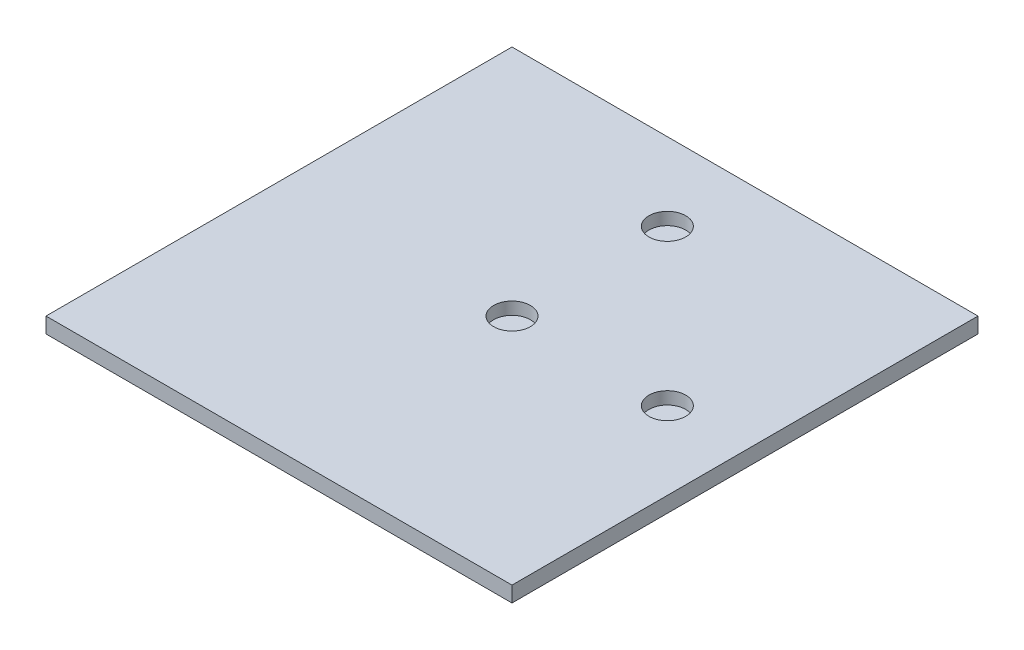
ISO-10303-21;
HEADER;
FILE_DESCRIPTION(('STEP AP214'),'2;1');
FILE_NAME('part.step','',(''),(''),'','','');
FILE_SCHEMA(('AUTOMOTIVE_DESIGN { 1 0 10303 214 1 1 1 1 }'));
ENDSEC;
DATA;
#1=APPLICATION_CONTEXT('core data for automotive mechanical design processes');
#2=APPLICATION_PROTOCOL_DEFINITION('international standard','automotive_design',2000,#1);
#3=PRODUCT_CONTEXT('',#1,'mechanical');
#4=PRODUCT('Part','Part','',(#3));
#5=PRODUCT_RELATED_PRODUCT_CATEGORY('part','',(#4));
#6=PRODUCT_DEFINITION_FORMATION('','',#4);
#7=PRODUCT_DEFINITION_CONTEXT('part definition',#1,'design');
#8=PRODUCT_DEFINITION('design','',#6,#7);
#9=PRODUCT_DEFINITION_SHAPE('','',#8);
#10=(LENGTH_UNIT() NAMED_UNIT(*) SI_UNIT(.MILLI.,.METRE.));
#11=(NAMED_UNIT(*) PLANE_ANGLE_UNIT() SI_UNIT($,.RADIAN.));
#12=(NAMED_UNIT(*) SI_UNIT($,.STERADIAN.) SOLID_ANGLE_UNIT());
#13=UNCERTAINTY_MEASURE_WITH_UNIT(LENGTH_MEASURE(1.E-05),#10,'distance_accuracy_value','');
#14=(GEOMETRIC_REPRESENTATION_CONTEXT(3) GLOBAL_UNCERTAINTY_ASSIGNED_CONTEXT((#13)) GLOBAL_UNIT_ASSIGNED_CONTEXT((#10,
#11,#12)) REPRESENTATION_CONTEXT('',''));
#15=CARTESIAN_POINT('',(0.,0.,0.));
#16=DIRECTION('',(0.,0.,1.));
#17=DIRECTION('',(1.,0.,0.));
#18=AXIS2_PLACEMENT_3D('',#15,#16,#17);
#19=CARTESIAN_POINT('',(75.,5.,-75.));
#20=DIRECTION('',(-1.,0.,0.));
#21=DIRECTION('',(0.,0.,1.));
#22=AXIS2_PLACEMENT_3D('',#19,#20,#21);
#23=PLANE('',#22);
#24=DIRECTION('',(0.,0.,-1.));
#25=VECTOR('',#24,1.);
#26=CARTESIAN_POINT('',(75.,0.,-75.));
#27=LINE('',#26,#25);
#28=CARTESIAN_POINT('',(75.,0.,75.));
#29=VERTEX_POINT('',#28);
#30=CARTESIAN_POINT('',(75.,0.,-75.));
#31=VERTEX_POINT('',#30);
#32=EDGE_CURVE('E97',#29,#31,#27,.T.);
#33=ORIENTED_EDGE('',*,*,#32,.T.);
#34=DIRECTION('',(0.,-1.,0.));
#35=VECTOR('',#34,1.);
#36=CARTESIAN_POINT('',(75.,5.,-75.));
#37=LINE('',#36,#35);
#38=CARTESIAN_POINT('',(75.,5.,-75.));
#39=VERTEX_POINT('',#38);
#40=EDGE_CURVE('E11',#39,#31,#37,.T.);
#41=ORIENTED_EDGE('',*,*,#40,.F.);
#42=DIRECTION('',(0.,0.,-1.));
#43=VECTOR('',#42,1.);
#44=CARTESIAN_POINT('',(75.,5.,-75.));
#45=LINE('',#44,#43);
#46=CARTESIAN_POINT('',(75.,5.,75.));
#47=VERTEX_POINT('',#46);
#48=EDGE_CURVE('E85',#47,#39,#45,.T.);
#49=ORIENTED_EDGE('',*,*,#48,.F.);
#50=DIRECTION('',(0.,-1.,0.));
#51=VECTOR('',#50,1.);
#52=CARTESIAN_POINT('',(75.,5.,75.));
#53=LINE('',#52,#51);
#54=EDGE_CURVE('E93',#47,#29,#53,.T.);
#55=ORIENTED_EDGE('',*,*,#54,.T.);
#56=EDGE_LOOP('',(#33,#41,#49,#55));
#57=FACE_BOUND('',#56,.T.);
#58=ADVANCED_FACE('F34',(#57),#23,.F.);
#59=CARTESIAN_POINT('',(-75.,5.,-75.));
#60=DIRECTION('',(0.,0.,1.));
#61=DIRECTION('',(1.,0.,0.));
#62=AXIS2_PLACEMENT_3D('',#59,#60,#61);
#63=PLANE('',#62);
#64=DIRECTION('',(-1.,0.,0.));
#65=VECTOR('',#64,1.);
#66=CARTESIAN_POINT('',(-75.,0.,-75.));
#67=LINE('',#66,#65);
#68=CARTESIAN_POINT('',(-75.,0.,-75.));
#69=VERTEX_POINT('',#68);
#70=EDGE_CURVE('E89',#31,#69,#67,.T.);
#71=ORIENTED_EDGE('',*,*,#70,.T.);
#72=DIRECTION('',(0.,-1.,0.));
#73=VECTOR('',#72,1.);
#74=CARTESIAN_POINT('',(-75.,5.,-75.));
#75=LINE('',#74,#73);
#76=CARTESIAN_POINT('',(-75.,5.,-75.));
#77=VERTEX_POINT('',#76);
#78=EDGE_CURVE('E42',#77,#69,#75,.T.);
#79=ORIENTED_EDGE('',*,*,#78,.F.);
#80=DIRECTION('',(-1.,0.,0.));
#81=VECTOR('',#80,1.);
#82=CARTESIAN_POINT('',(-75.,5.,-75.));
#83=LINE('',#82,#81);
#84=EDGE_CURVE('E80',#39,#77,#83,.T.);
#85=ORIENTED_EDGE('',*,*,#84,.F.);
#86=ORIENTED_EDGE('',*,*,#40,.T.);
#87=EDGE_LOOP('',(#71,#79,#85,#86));
#88=FACE_BOUND('',#87,.T.);
#89=ADVANCED_FACE('F88',(#88),#63,.F.);
#90=CARTESIAN_POINT('',(-75.,5.,-75.));
#91=DIRECTION('',(1.,0.,0.));
#92=DIRECTION('',(0.,0.,-1.));
#93=AXIS2_PLACEMENT_3D('',#90,#91,#92);
#94=PLANE('',#93);
#95=DIRECTION('',(0.,0.,1.));
#96=VECTOR('',#95,1.);
#97=CARTESIAN_POINT('',(-75.,0.,-75.));
#98=LINE('',#97,#96);
#99=CARTESIAN_POINT('',(-75.,0.,75.));
#100=VERTEX_POINT('',#99);
#101=EDGE_CURVE('E67',#69,#100,#98,.T.);
#102=ORIENTED_EDGE('',*,*,#101,.T.);
#103=DIRECTION('',(0.,-1.,0.));
#104=VECTOR('',#103,1.);
#105=CARTESIAN_POINT('',(-75.,5.,75.));
#106=LINE('',#105,#104);
#107=CARTESIAN_POINT('',(-75.,5.,75.));
#108=VERTEX_POINT('',#107);
#109=EDGE_CURVE('E90',#108,#100,#106,.T.);
#110=ORIENTED_EDGE('',*,*,#109,.F.);
#111=DIRECTION('',(0.,0.,1.));
#112=VECTOR('',#111,1.);
#113=CARTESIAN_POINT('',(-75.,5.,-75.));
#114=LINE('',#113,#112);
#115=EDGE_CURVE('E83',#77,#108,#114,.T.);
#116=ORIENTED_EDGE('',*,*,#115,.F.);
#117=ORIENTED_EDGE('',*,*,#78,.T.);
#118=EDGE_LOOP('',(#102,#110,#116,#117));
#119=FACE_BOUND('',#118,.T.);
#120=ADVANCED_FACE('F91',(#119),#94,.F.);
#121=CARTESIAN_POINT('',(-75.,5.,75.));
#122=DIRECTION('',(0.,0.,-1.));
#123=DIRECTION('',(-1.,0.,0.));
#124=AXIS2_PLACEMENT_3D('',#121,#122,#123);
#125=PLANE('',#124);
#126=DIRECTION('',(1.,0.,0.));
#127=VECTOR('',#126,1.);
#128=CARTESIAN_POINT('',(-75.,0.,75.));
#129=LINE('',#128,#127);
#130=EDGE_CURVE('E73',#100,#29,#129,.T.);
#131=ORIENTED_EDGE('',*,*,#130,.T.);
#132=ORIENTED_EDGE('',*,*,#54,.F.);
#133=DIRECTION('',(1.,0.,0.));
#134=VECTOR('',#133,1.);
#135=CARTESIAN_POINT('',(-75.,5.,75.));
#136=LINE('',#135,#134);
#137=EDGE_CURVE('E50',#108,#47,#136,.T.);
#138=ORIENTED_EDGE('',*,*,#137,.F.);
#139=ORIENTED_EDGE('',*,*,#109,.T.);
#140=EDGE_LOOP('',(#131,#132,#138,#139));
#141=FACE_BOUND('',#140,.T.);
#142=ADVANCED_FACE('F105',(#141),#125,.F.);
#143=CARTESIAN_POINT('',(0.,5.,0.));
#144=DIRECTION('',(0.,1.,0.));
#145=DIRECTION('',(0.,0.,1.));
#146=AXIS2_PLACEMENT_3D('',#143,#144,#145);
#147=PLANE('',#146);
#148=CARTESIAN_POINT('',(0.,5.,-50.));
#149=DIRECTION('',(0.,1.,0.));
#150=DIRECTION('',(0.,0.,1.));
#151=AXIS2_PLACEMENT_3D('',#148,#149,#150);
#152=CIRCLE('',#151,5.925);
#153=CARTESIAN_POINT('',(0.,5.,-44.075));
#154=VERTEX_POINT('',#153);
#155=EDGE_CURVE('E117',#154,#154,#152,.T.);
#156=ORIENTED_EDGE('',*,*,#155,.F.);
#157=EDGE_LOOP('',(#156));
#158=FACE_BOUND('',#157,.T.);
#159=CARTESIAN_POINT('',(50.,5.,0.));
#160=DIRECTION('',(0.,1.,0.));
#161=DIRECTION('',(0.,0.,1.));
#162=AXIS2_PLACEMENT_3D('',#159,#160,#161);
#163=CIRCLE('',#162,5.925);
#164=CARTESIAN_POINT('',(50.,5.,5.925));
#165=VERTEX_POINT('',#164);
#166=EDGE_CURVE('E123',#165,#165,#163,.T.);
#167=ORIENTED_EDGE('',*,*,#166,.F.);
#168=EDGE_LOOP('',(#167));
#169=FACE_BOUND('',#168,.T.);
#170=CARTESIAN_POINT('',(0.,5.,0.));
#171=DIRECTION('',(0.,1.,0.));
#172=DIRECTION('',(0.,0.,1.));
#173=AXIS2_PLACEMENT_3D('',#170,#171,#172);
#174=CIRCLE('',#173,5.925);
#175=CARTESIAN_POINT('',(0.,5.,5.925));
#176=VERTEX_POINT('',#175);
#177=EDGE_CURVE('E111',#176,#176,#174,.T.);
#178=ORIENTED_EDGE('',*,*,#177,.F.);
#179=EDGE_LOOP('',(#178));
#180=FACE_BOUND('',#179,.T.);
#181=ORIENTED_EDGE('',*,*,#48,.T.);
#182=ORIENTED_EDGE('',*,*,#84,.T.);
#183=ORIENTED_EDGE('',*,*,#115,.T.);
#184=ORIENTED_EDGE('',*,*,#137,.T.);
#185=EDGE_LOOP('',(#181,#182,#183,#184));
#186=FACE_BOUND('',#185,.T.);
#187=ADVANCED_FACE('F81',(#158,#169,#180,#186),#147,.T.);
#188=CARTESIAN_POINT('',(0.,0.,0.));
#189=DIRECTION('',(0.,1.,0.));
#190=DIRECTION('',(0.,0.,1.));
#191=AXIS2_PLACEMENT_3D('',#188,#189,#190);
#192=PLANE('',#191);
#193=ORIENTED_EDGE('',*,*,#32,.F.);
#194=ORIENTED_EDGE('',*,*,#130,.F.);
#195=ORIENTED_EDGE('',*,*,#101,.F.);
#196=ORIENTED_EDGE('',*,*,#70,.F.);
#197=EDGE_LOOP('',(#193,#194,#195,#196));
#198=FACE_BOUND('',#197,.T.);
#199=ADVANCED_FACE('F108',(#198),#192,.F.);
#200=CARTESIAN_POINT('',(0.,1.,0.));
#201=DIRECTION('',(0.,1.,0.));
#202=DIRECTION('',(0.,0.,1.));
#203=AXIS2_PLACEMENT_3D('',#200,#201,#202);
#204=CYLINDRICAL_SURFACE('',#203,5.925);
#205=CARTESIAN_POINT('',(0.,1.,0.));
#206=DIRECTION('',(0.,1.,0.));
#207=DIRECTION('',(0.,0.,1.));
#208=AXIS2_PLACEMENT_3D('',#205,#206,#207);
#209=CIRCLE('',#208,5.925);
#210=CARTESIAN_POINT('',(0.,1.,5.925));
#211=VERTEX_POINT('',#210);
#212=EDGE_CURVE('E100',#211,#211,#209,.T.);
#213=ORIENTED_EDGE('',*,*,#212,.F.);
#214=EDGE_LOOP('',(#213));
#215=FACE_BOUND('',#214,.T.);
#216=ORIENTED_EDGE('',*,*,#177,.T.);
#217=EDGE_LOOP('',(#216));
#218=FACE_BOUND('',#217,.T.);
#219=ADVANCED_FACE('F144',(#215,#218),#204,.F.);
#220=CARTESIAN_POINT('',(0.,1.,0.));
#221=DIRECTION('',(0.,1.,0.));
#222=DIRECTION('',(0.,0.,1.));
#223=AXIS2_PLACEMENT_3D('',#220,#221,#222);
#224=PLANE('',#223);
#225=ORIENTED_EDGE('',*,*,#212,.T.);
#226=EDGE_LOOP('',(#225));
#227=FACE_BOUND('',#226,.T.);
#228=ADVANCED_FACE('F134',(#227),#224,.T.);
#229=CARTESIAN_POINT('',(50.,1.,0.));
#230=DIRECTION('',(0.,1.,0.));
#231=DIRECTION('',(0.,0.,1.));
#232=AXIS2_PLACEMENT_3D('',#229,#230,#231);
#233=CYLINDRICAL_SURFACE('',#232,5.925);
#234=CARTESIAN_POINT('',(50.,1.,0.));
#235=DIRECTION('',(0.,1.,0.));
#236=DIRECTION('',(0.,0.,1.));
#237=AXIS2_PLACEMENT_3D('',#234,#235,#236);
#238=CIRCLE('',#237,5.925);
#239=CARTESIAN_POINT('',(50.,1.,5.925));
#240=VERTEX_POINT('',#239);
#241=EDGE_CURVE('E114',#240,#240,#238,.T.);
#242=ORIENTED_EDGE('',*,*,#241,.F.);
#243=EDGE_LOOP('',(#242));
#244=FACE_BOUND('',#243,.T.);
#245=ORIENTED_EDGE('',*,*,#166,.T.);
#246=EDGE_LOOP('',(#245));
#247=FACE_BOUND('',#246,.T.);
#248=ADVANCED_FACE('F131',(#244,#247),#233,.F.);
#249=CARTESIAN_POINT('',(50.,1.,0.));
#250=DIRECTION('',(0.,1.,0.));
#251=DIRECTION('',(0.,0.,1.));
#252=AXIS2_PLACEMENT_3D('',#249,#250,#251);
#253=PLANE('',#252);
#254=ORIENTED_EDGE('',*,*,#241,.T.);
#255=EDGE_LOOP('',(#254));
#256=FACE_BOUND('',#255,.T.);
#257=ADVANCED_FACE('F129',(#256),#253,.T.);
#258=CARTESIAN_POINT('',(0.,1.,-50.));
#259=DIRECTION('',(0.,1.,0.));
#260=DIRECTION('',(0.,0.,1.));
#261=AXIS2_PLACEMENT_3D('',#258,#259,#260);
#262=CYLINDRICAL_SURFACE('',#261,5.925);
#263=CARTESIAN_POINT('',(0.,1.,-50.));
#264=DIRECTION('',(0.,1.,0.));
#265=DIRECTION('',(0.,0.,1.));
#266=AXIS2_PLACEMENT_3D('',#263,#264,#265);
#267=CIRCLE('',#266,5.925);
#268=CARTESIAN_POINT('',(0.,1.,-44.075));
#269=VERTEX_POINT('',#268);
#270=EDGE_CURVE('E120',#269,#269,#267,.T.);
#271=ORIENTED_EDGE('',*,*,#270,.F.);
#272=EDGE_LOOP('',(#271));
#273=FACE_BOUND('',#272,.T.);
#274=ORIENTED_EDGE('',*,*,#155,.T.);
#275=EDGE_LOOP('',(#274));
#276=FACE_BOUND('',#275,.T.);
#277=ADVANCED_FACE('F204',(#273,#276),#262,.F.);
#278=CARTESIAN_POINT('',(0.,1.,-50.));
#279=DIRECTION('',(0.,1.,0.));
#280=DIRECTION('',(0.,0.,1.));
#281=AXIS2_PLACEMENT_3D('',#278,#279,#280);
#282=PLANE('',#281);
#283=ORIENTED_EDGE('',*,*,#270,.T.);
#284=EDGE_LOOP('',(#283));
#285=FACE_BOUND('',#284,.T.);
#286=ADVANCED_FACE('F212',(#285),#282,.T.);
#287=CLOSED_SHELL('',(#58,#89,#120,#142,#187,#199,#219,#228,#248,#257,#277,#286));
#288=MANIFOLD_SOLID_BREP('B2',#287);
#289=ADVANCED_BREP_SHAPE_REPRESENTATION('',(#18,#288),#14);
#290=SHAPE_DEFINITION_REPRESENTATION(#9,#289);
ENDSEC;
END-ISO-10303-21;
